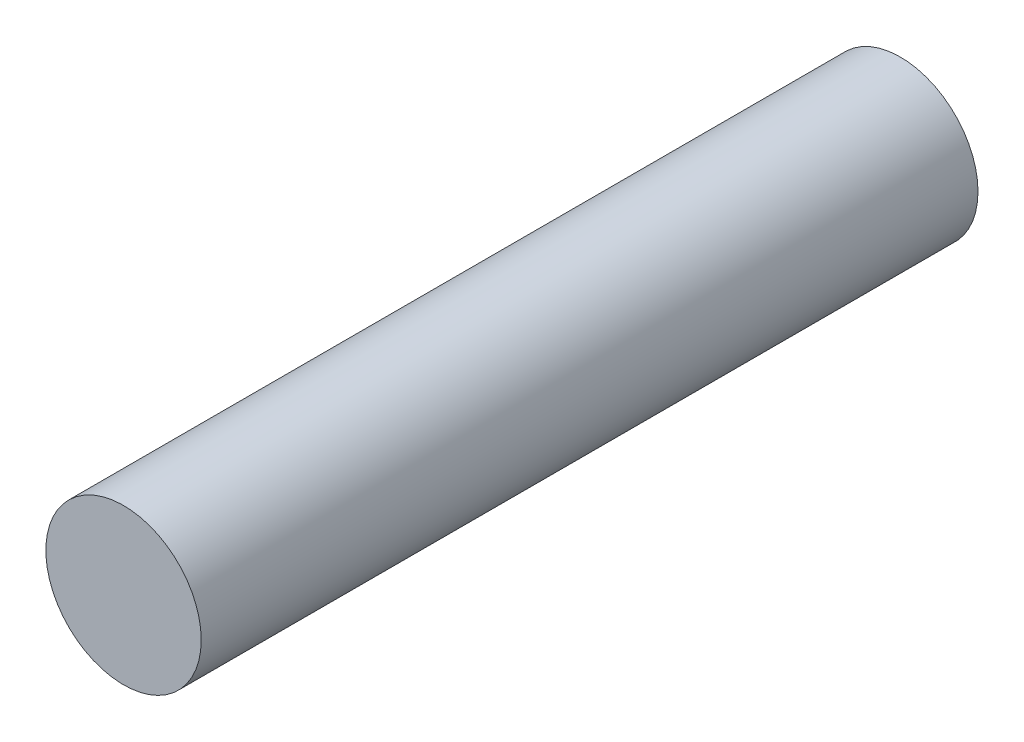
ISO-10303-21;
HEADER;
FILE_DESCRIPTION(('STEP AP214'),'2;1');
FILE_NAME('part.step','',(''),(''),'','','');
FILE_SCHEMA(('AUTOMOTIVE_DESIGN { 1 0 10303 214 1 1 1 1 }'));
ENDSEC;
DATA;
#1=APPLICATION_CONTEXT('core data for automotive mechanical design processes');
#2=APPLICATION_PROTOCOL_DEFINITION('international standard','automotive_design',2000,#1);
#3=PRODUCT_CONTEXT('',#1,'mechanical');
#4=PRODUCT('Part','Part','',(#3));
#5=PRODUCT_RELATED_PRODUCT_CATEGORY('part','',(#4));
#6=PRODUCT_DEFINITION_FORMATION('','',#4);
#7=PRODUCT_DEFINITION_CONTEXT('part definition',#1,'design');
#8=PRODUCT_DEFINITION('design','',#6,#7);
#9=PRODUCT_DEFINITION_SHAPE('','',#8);
#10=(LENGTH_UNIT() NAMED_UNIT(*) SI_UNIT(.MILLI.,.METRE.));
#11=(NAMED_UNIT(*) PLANE_ANGLE_UNIT() SI_UNIT($,.RADIAN.));
#12=(NAMED_UNIT(*) SI_UNIT($,.STERADIAN.) SOLID_ANGLE_UNIT());
#13=UNCERTAINTY_MEASURE_WITH_UNIT(LENGTH_MEASURE(1.E-05),#10,'distance_accuracy_value','');
#14=(GEOMETRIC_REPRESENTATION_CONTEXT(3) GLOBAL_UNCERTAINTY_ASSIGNED_CONTEXT((#13)) GLOBAL_UNIT_ASSIGNED_CONTEXT((#10,
#11,#12)) REPRESENTATION_CONTEXT('',''));
#15=CARTESIAN_POINT('',(0.,0.,0.));
#16=DIRECTION('',(0.,0.,1.));
#17=DIRECTION('',(1.,0.,0.));
#18=AXIS2_PLACEMENT_3D('',#15,#16,#17);
#19=CARTESIAN_POINT('',(0.,0.,0.));
#20=DIRECTION('',(0.,0.,1.));
#21=DIRECTION('',(1.,0.,0.));
#22=AXIS2_PLACEMENT_3D('',#19,#20,#21);
#23=CYLINDRICAL_SURFACE('',#22,0.5);
#24=CARTESIAN_POINT('',(0.,0.,-5.));
#25=DIRECTION('',(0.,0.,1.));
#26=DIRECTION('',(1.,0.,0.));
#27=AXIS2_PLACEMENT_3D('',#24,#25,#26);
#28=CIRCLE('',#27,0.5);
#29=CARTESIAN_POINT('',(0.5,0.,-5.));
#30=VERTEX_POINT('',#29);
#31=EDGE_CURVE('E44',#30,#30,#28,.T.);
#32=ORIENTED_EDGE('',*,*,#31,.T.);
#33=EDGE_LOOP('',(#32));
#34=FACE_BOUND('',#33,.T.);
#35=CARTESIAN_POINT('',(0.,0.,0.));
#36=DIRECTION('',(0.,0.,1.));
#37=DIRECTION('',(1.,0.,0.));
#38=AXIS2_PLACEMENT_3D('',#35,#36,#37);
#39=CIRCLE('',#38,0.5);
#40=CARTESIAN_POINT('',(0.5,0.,0.));
#41=VERTEX_POINT('',#40);
#42=EDGE_CURVE('E10',#41,#41,#39,.T.);
#43=ORIENTED_EDGE('',*,*,#42,.F.);
#44=EDGE_LOOP('',(#43));
#45=FACE_BOUND('',#44,.T.);
#46=ADVANCED_FACE('F37',(#34,#45),#23,.T.);
#47=CARTESIAN_POINT('',(0.5,0.,0.));
#48=DIRECTION('',(0.,0.,-1.));
#49=DIRECTION('',(-1.,0.,0.));
#50=AXIS2_PLACEMENT_3D('',#47,#48,#49);
#51=PLANE('',#50);
#52=ORIENTED_EDGE('',*,*,#42,.T.);
#53=EDGE_LOOP('',(#52));
#54=FACE_BOUND('',#53,.T.);
#55=ADVANCED_FACE('F55',(#54),#51,.F.);
#56=CARTESIAN_POINT('',(0.,0.,-5.));
#57=DIRECTION('',(0.,0.,1.));
#58=DIRECTION('',(1.,0.,0.));
#59=AXIS2_PLACEMENT_3D('',#56,#57,#58);
#60=PLANE('',#59);
#61=ORIENTED_EDGE('',*,*,#31,.F.);
#62=EDGE_LOOP('',(#61));
#63=FACE_BOUND('',#62,.T.);
#64=ADVANCED_FACE('F53',(#63),#60,.F.);
#65=CLOSED_SHELL('',(#46,#55,#64));
#66=MANIFOLD_SOLID_BREP('B2',#65);
#67=ADVANCED_BREP_SHAPE_REPRESENTATION('',(#18,#66),#14);
#68=SHAPE_DEFINITION_REPRESENTATION(#9,#67);
ENDSEC;
END-ISO-10303-21;
